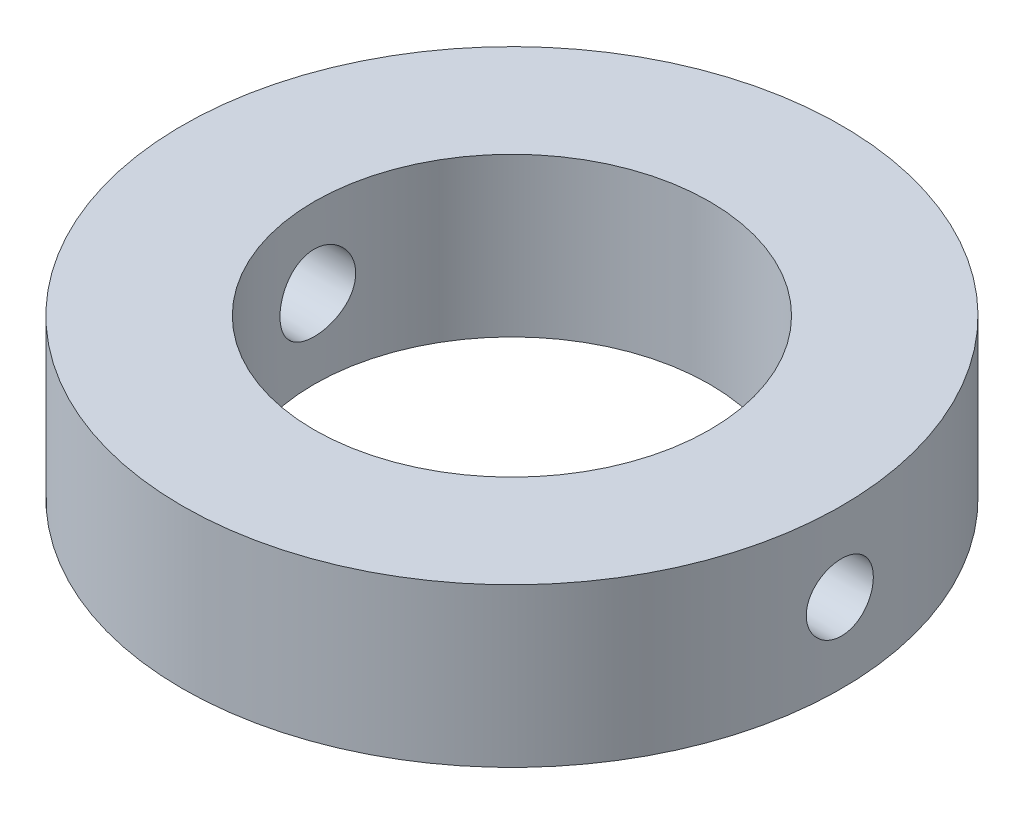
ISO-10303-21;
HEADER;
FILE_DESCRIPTION(('STEP AP214'),'2;1');
FILE_NAME('part.step','',(''),(''),'','','');
FILE_SCHEMA(('AUTOMOTIVE_DESIGN { 1 0 10303 214 1 1 1 1 }'));
ENDSEC;
DATA;
#1=APPLICATION_CONTEXT('core data for automotive mechanical design processes');
#2=APPLICATION_PROTOCOL_DEFINITION('international standard','automotive_design',2000,#1);
#3=PRODUCT_CONTEXT('',#1,'mechanical');
#4=PRODUCT('Part','Part','',(#3));
#5=PRODUCT_RELATED_PRODUCT_CATEGORY('part','',(#4));
#6=PRODUCT_DEFINITION_FORMATION('','',#4);
#7=PRODUCT_DEFINITION_CONTEXT('part definition',#1,'design');
#8=PRODUCT_DEFINITION('design','',#6,#7);
#9=PRODUCT_DEFINITION_SHAPE('','',#8);
#10=(LENGTH_UNIT() NAMED_UNIT(*) SI_UNIT(.MILLI.,.METRE.));
#11=(NAMED_UNIT(*) PLANE_ANGLE_UNIT() SI_UNIT($,.RADIAN.));
#12=(NAMED_UNIT(*) SI_UNIT($,.STERADIAN.) SOLID_ANGLE_UNIT());
#13=UNCERTAINTY_MEASURE_WITH_UNIT(LENGTH_MEASURE(1.E-05),#10,'distance_accuracy_value','');
#14=(GEOMETRIC_REPRESENTATION_CONTEXT(3) GLOBAL_UNCERTAINTY_ASSIGNED_CONTEXT((#13)) GLOBAL_UNIT_ASSIGNED_CONTEXT((#10,
#11,#12)) REPRESENTATION_CONTEXT('',''));
#15=CARTESIAN_POINT('',(0.,0.,0.));
#16=DIRECTION('',(0.,0.,1.));
#17=DIRECTION('',(1.,0.,0.));
#18=AXIS2_PLACEMENT_3D('',#15,#16,#17);
#19=CARTESIAN_POINT('',(0.05369384699367,7.98000184373753,7.33379435484455E-06));
#20=DIRECTION('',(0.,-1.,0.));
#21=DIRECTION('',(0.,0.,-1.));
#22=AXIS2_PLACEMENT_3D('',#19,#20,#21);
#23=CYLINDRICAL_SURFACE('',#22,8.25);
#24=CARTESIAN_POINT('',(0.05369384699367,7.98000184373753,7.33379435484455E-06));
#25=DIRECTION('',(0.,1.,0.));
#26=DIRECTION('',(0.,0.,1.));
#27=AXIS2_PLACEMENT_3D('',#24,#25,#26);
#28=CIRCLE('',#27,8.25);
#29=CARTESIAN_POINT('',(0.05369384699367,7.98000184373753,8.25000733379436));
#30=VERTEX_POINT('',#29);
#31=EDGE_CURVE('E10',#30,#30,#28,.T.);
#32=ORIENTED_EDGE('',*,*,#31,.F.);
#33=EDGE_LOOP('',(#32));
#34=FACE_BOUND('',#33,.T.);
#35=CARTESIAN_POINT('',(0.05369384699367,4.02000184373753,7.33379435484455E-06));
#36=DIRECTION('',(0.,1.,0.));
#37=DIRECTION('',(0.,0.,1.));
#38=AXIS2_PLACEMENT_3D('',#35,#36,#37);
#39=CIRCLE('',#38,8.25);
#40=CARTESIAN_POINT('',(0.05369384699367,4.02000184373753,8.25000733379436));
#41=VERTEX_POINT('',#40);
#42=EDGE_CURVE('E50',#41,#41,#39,.T.);
#43=ORIENTED_EDGE('',*,*,#42,.T.);
#44=EDGE_LOOP('',(#43));
#45=FACE_BOUND('',#44,.T.);
#46=CARTESIAN_POINT('',(8.281543153376,5.4179232808724,-0.604141481866051));
#47=CARTESIAN_POINT('',(8.27914441839346,5.4518043739237,-0.636809933368332));
#48=CARTESIAN_POINT('',(8.27675797303766,5.48846330693886,-0.666642796564216));
#49=CARTESIAN_POINT('',(8.27227895612903,5.56630631701054,-0.719766153946628));
#50=CARTESIAN_POINT('',(8.27018670383326,5.60749522493009,-0.743049567687996));
#51=CARTESIAN_POINT('',(8.26653554921752,5.69321143001678,-0.782375355667081));
#52=CARTESIAN_POINT('',(8.26497652147406,5.73773793911505,-0.798419433003812));
#53=CARTESIAN_POINT('',(8.26256956120308,5.82886011761066,-0.822799531657169));
#54=CARTESIAN_POINT('',(8.26172145062824,5.87545526584275,-0.83113748300649));
#55=CARTESIAN_POINT('',(8.260834442908,5.96922438513462,-0.839851433456671));
#56=CARTESIAN_POINT('',(8.26079267472097,6.0163957039339,-0.840255681180892));
#57=CARTESIAN_POINT('',(8.26151578371179,6.1101351489498,-0.833162142463666));
#58=CARTESIAN_POINT('',(8.26228068084862,6.15670326021267,-0.825664160500793));
#59=CARTESIAN_POINT('',(8.26452771770222,6.24781969679537,-0.803008905205402));
#60=CARTESIAN_POINT('',(8.26600843010086,6.29237184937326,-0.787866871277587));
#61=CARTESIAN_POINT('',(8.2695193649486,6.37830528278482,-0.75036838302934));
#62=CARTESIAN_POINT('',(8.27154960028617,6.41968648921822,-0.728011759496252));
#63=CARTESIAN_POINT('',(8.27594077195377,6.49828083709476,-0.676617271438643));
#64=CARTESIAN_POINT('',(8.27830297169017,6.53547702873221,-0.647553596037037));
#65=CARTESIAN_POINT('',(8.28308715067142,6.60447767694655,-0.583611694166962));
#66=CARTESIAN_POINT('',(8.28550913135941,6.63628200321425,-0.548733327210947));
#67=CARTESIAN_POINT('',(8.2901513216174,6.69372208164756,-0.473989672669532));
#68=CARTESIAN_POINT('',(8.29237070630131,6.71933325946909,-0.434105442228705));
#69=CARTESIAN_POINT('',(8.29634712300738,6.76349586655491,-0.3505817261051));
#70=CARTESIAN_POINT('',(8.29810416050213,6.78204737938205,-0.306942284878963));
#71=CARTESIAN_POINT('',(8.30095521184912,6.81152897448688,-0.217223612474388));
#72=CARTESIAN_POINT('',(8.30205037223232,6.8224722410588,-0.171148751510458));
#73=CARTESIAN_POINT('',(8.30345887904823,6.83646896406458,-0.0778046128225622));
#74=CARTESIAN_POINT('',(8.30377224817821,6.83952264955201,-0.0305353698146244));
#75=CARTESIAN_POINT('',(8.30358225763077,6.83765484257123,0.0636445275321381));
#76=CARTESIAN_POINT('',(8.30308231533681,6.83276672021477,0.110555854457408));
#77=CARTESIAN_POINT('',(8.30132821873207,6.81522121266067,0.202887296133946));
#78=CARTESIAN_POINT('',(8.30007406299377,6.8025638127579,0.248307408062581));
#79=CARTESIAN_POINT('',(8.29695149641156,6.76984341630692,0.336380730736448));
#80=CARTESIAN_POINT('',(8.29508299589419,6.74977933858298,0.379033536460137));
#81=CARTESIAN_POINT('',(8.2909400038241,6.702816907517,0.460372852304088));
#82=CARTESIAN_POINT('',(8.28866550037064,6.6759183538334,0.499059246108764));
#83=CARTESIAN_POINT('',(8.28395350920555,6.61591375830947,0.571543002704544));
#84=CARTESIAN_POINT('',(8.28151536980545,6.58278181681244,0.605318885122982));
#85=CARTESIAN_POINT('',(8.27675860110145,6.51131457687402,0.666835989191299));
#86=CARTESIAN_POINT('',(8.2744399731219,6.47297922078867,0.69457714397898));
#87=CARTESIAN_POINT('',(8.27018064193647,6.39211838308672,0.743274060544141));
#88=CARTESIAN_POINT('',(8.26824050711849,6.34958674188914,0.764219648134994));
#89=CARTESIAN_POINT('',(8.26496364847715,6.26158558645108,0.798662119591424));
#90=CARTESIAN_POINT('',(8.26362690727173,6.21611615688314,0.812159218029431));
#91=CARTESIAN_POINT('',(8.26171408972452,6.12372765523641,0.831269375859325));
#92=CARTESIAN_POINT('',(8.26113493220413,6.07681525440201,0.836914376601099));
#93=CARTESIAN_POINT('',(8.2607934579889,5.9827058254178,0.840256734760433));
#94=CARTESIAN_POINT('',(8.26103112121582,5.9355088042927,0.83795428753396));
#95=CARTESIAN_POINT('',(8.26229363737728,5.84235363994318,0.825493666328342));
#96=CARTESIAN_POINT('',(8.26331557068489,5.79639155474618,0.815364627692853));
#97=CARTESIAN_POINT('',(8.26602728831908,5.70682232293578,0.787581280275774));
#98=CARTESIAN_POINT('',(8.26771708214369,5.66321520982378,0.769926864471286));
#99=CARTESIAN_POINT('',(8.27157872533978,5.5794810255187,0.727550905212589));
#100=CARTESIAN_POINT('',(8.27375166148677,5.53936208815808,0.702813392428938));
#101=CARTESIAN_POINT('',(8.27833356368045,5.46383192966015,0.646987595186825));
#102=CARTESIAN_POINT('',(8.280742537573,5.42842086510422,0.615899099585172));
#103=CARTESIAN_POINT('',(8.28553922015379,5.36313362145758,0.548076993355185));
#104=CARTESIAN_POINT('',(8.28792677085323,5.33328488032926,0.511316952730326));
#105=CARTESIAN_POINT('',(8.29240048506751,5.2801761010273,0.433294025304907));
#106=CARTESIAN_POINT('',(8.29448664781506,5.25691607962768,0.392031127041032));
#107=CARTESIAN_POINT('',(8.29812348305305,5.21764399509632,0.306153437937454));
#108=CARTESIAN_POINT('',(8.2996740174055,5.20163380135693,0.261537786032875));
#109=CARTESIAN_POINT('',(8.30206378091719,5.17733639548718,0.170234494301596));
#110=CARTESIAN_POINT('',(8.30290305574807,5.16904868747444,0.123546987716187));
#111=CARTESIAN_POINT('',(8.30377367396642,5.16045662858152,0.0296386901584073));
#112=CARTESIAN_POINT('',(8.30380847442263,5.16011811750802,-0.0175789462114635));
#113=CARTESIAN_POINT('',(8.30307491531791,5.16734900429098,-0.111409432492594));
#114=CARTESIAN_POINT('',(8.30230638621326,5.17492007147377,-0.158022152633081));
#115=CARTESIAN_POINT('',(8.30005398847603,5.19773284018011,-0.249242274313732));
#116=CARTESIAN_POINT('',(8.29857106401594,5.21296441844173,-0.293852237944114));
#117=CARTESIAN_POINT('',(8.29505660565977,5.25064755193672,-0.379847773602653));
#118=CARTESIAN_POINT('',(8.29302565066879,5.27309149323061,-0.42123668904029));
#119=CARTESIAN_POINT('',(8.28937757122083,5.31591362015142,-0.486510693378438));
#120=CARTESIAN_POINT('',(8.28784949484164,5.33446838657481,-0.511617312153325));
#121=CARTESIAN_POINT('',(8.284726865656,5.37425011799443,-0.55961130608443));
#122=CARTESIAN_POINT('',(8.28313231252842,5.39547709590044,-0.582498670518217));
#123=CARTESIAN_POINT('',(8.281543153376,5.4179232808724,-0.604141481866051));
#124=B_SPLINE_CURVE_WITH_KNOTS('',3,(#46,#47,#48,#49,#50,#51,#52,#53,#54,#55,#56,#57,#58,#59,
#60,#61,#62,#63,#64,#65,#66,#67,#68,#69,#70,#71,#72,#73,#74,#75,#76,#77,#78,#79,#80,#81,#82,#83,
#84,#85,#86,#87,#88,#89,#90,#91,#92,#93,#94,#95,#96,#97,#98,#99,#100,#101,#102,#103,#104,#105,
#106,#107,#108,#109,#110,#111,#112,#113,#114,#115,#116,#117,#118,#119,#120,#121,#122,#123),
.UNSPECIFIED.,.T.,.F.,(4,2,2,2,2,2,2,2,2,2,2,2,2,2,2,2,2,2,2,2,2,2,2,2,2,2,2,2,2,2,2,2,2,2,2,2,
2,2,4),(0.,0.141266561509224,0.282685260898516,0.42407067328882,0.565420665485513,
0.706267277401448,0.847117374305536,0.98768777078774,1.12826146448027,1.26938542820794,
1.41051280209645,1.55219130207197,1.69386812499537,1.83529882073609,1.97672541035625,
2.11755928510037,2.25839342640526,2.39924813384084,2.54010697067973,2.68156454444276,
2.82302368541535,2.96469364917587,3.10635953156432,3.24744743266647,3.38853186571607,
3.52909361193858,3.66965735724064,3.81054054278327,3.95142841285563,4.09299385501519,
4.2345596575786,4.37616194260137,4.51775513431915,4.65873974379646,4.79975411426324,
4.94058262386613,5.081262949508,5.17485143101583,5.26844036467826),.UNSPECIFIED.);
#125=CARTESIAN_POINT('',(8.281543153376,5.4179232808724,-0.604141481866051));
#126=VERTEX_POINT('',#125);
#127=EDGE_CURVE('E80',#126,#126,#124,.T.);
#128=ORIENTED_EDGE('',*,*,#127,.F.);
#129=EDGE_LOOP('',(#128));
#130=FACE_BOUND('',#129,.T.);
#131=CARTESIAN_POINT('',(-8.1665029028169,5.32050658542989,-0.700610532380716));
#132=CARTESIAN_POINT('',(-8.169750768116,5.28117652553001,-0.662500873762695));
#133=CARTESIAN_POINT('',(-8.17301580716168,5.24503662954337,-0.621050521829441));
#134=CARTESIAN_POINT('',(-8.17921354627576,5.1801859346757,-0.532627428870309));
#135=CARTESIAN_POINT('',(-8.1821458960634,5.1514829258558,-0.485648971492122));
#136=CARTESIAN_POINT('',(-8.18734606111301,5.10236299364315,-0.3875127247289));
#137=CARTESIAN_POINT('',(-8.18961398933311,5.08194466154715,-0.3363556476433));
#138=CARTESIAN_POINT('',(-8.1932295897774,5.04999430408332,-0.231320235207912));
#139=CARTESIAN_POINT('',(-8.19457749480215,5.03846003061864,-0.177442591972542));
#140=CARTESIAN_POINT('',(-8.1961977554654,5.02464484710596,-0.0687530906533021));
#141=CARTESIAN_POINT('',(-8.19647509602801,5.02232104849267,-0.0139467588804861));
#142=CARTESIAN_POINT('',(-8.19593683667822,5.02687833036017,0.0952773473122893));
#143=CARTESIAN_POINT('',(-8.19512122024281,5.03375954999981,0.149695115845557));
#144=CARTESIAN_POINT('',(-8.19249314764508,5.05648325090549,0.256406979905305));
#145=CARTESIAN_POINT('',(-8.19068406415385,5.07229541809973,0.308707621305202));
#146=CARTESIAN_POINT('',(-8.18627244392618,5.1123982206883,0.409914190982378));
#147=CARTESIAN_POINT('',(-8.1836698855177,5.13668908766247,0.458820026493134));
#148=CARTESIAN_POINT('',(-8.17794598090329,5.19318708883011,0.552096120055921));
#149=CARTESIAN_POINT('',(-8.17482231471301,5.22542994711939,0.596444594110067));
#150=CARTESIAN_POINT('',(-8.16841201766017,5.29686787308332,0.67912287426919));
#151=CARTESIAN_POINT('',(-8.16512538081995,5.33606319590623,0.717452459389792));
#152=CARTESIAN_POINT('',(-8.15873699639936,5.42055870811808,0.787228674866759));
#153=CARTESIAN_POINT('',(-8.1556364071936,5.46589236383708,0.818634902018703));
#154=CARTESIAN_POINT('',(-8.14999180834422,5.56122005976149,0.873392991532286));
#155=CARTESIAN_POINT('',(-8.14744779252478,5.61121404824621,0.896744943267309));
#156=CARTESIAN_POINT('',(-8.14321025481396,5.71436888063927,0.934688807589225));
#157=CARTESIAN_POINT('',(-8.14151540709326,5.76752464188109,0.949294383137205));
#158=CARTESIAN_POINT('',(-8.1391651065917,5.87555573924513,0.969370963022904));
#159=CARTESIAN_POINT('',(-8.13850961043764,5.93043100351329,0.974842348540124));
#160=CARTESIAN_POINT('',(-8.13831416399643,6.03999610412597,0.976483303833195));
#161=CARTESIAN_POINT('',(-8.13876763034108,6.09468511405518,0.972707767862687));
#162=CARTESIAN_POINT('',(-8.1407244097187,6.20264571520595,0.956081792603448));
#163=CARTESIAN_POINT('',(-8.14222772009817,6.25591731000971,0.94323137625162));
#164=CARTESIAN_POINT('',(-8.14611194100356,6.35950436527041,0.908842820806134));
#165=CARTESIAN_POINT('',(-8.14849228574602,6.40982170733659,0.887310281791853));
#166=CARTESIAN_POINT('',(-8.15386267900251,6.50613711793617,0.836173525923888));
#167=CARTESIAN_POINT('',(-8.15685275098524,6.55213502011262,0.806568998360557));
#168=CARTESIAN_POINT('',(-8.16312668713303,6.63878596604137,0.73992848654822));
#169=CARTESIAN_POINT('',(-8.16641212087595,6.67940722783769,0.70285132032146));
#170=CARTESIAN_POINT('',(-8.17289378492025,6.75386270562605,0.622406583936499));
#171=CARTESIAN_POINT('',(-8.17609001341115,6.78769678395405,0.579038886218573));
#172=CARTESIAN_POINT('',(-8.18204394447004,6.84770827415085,0.487088688033914));
#173=CARTESIAN_POINT('',(-8.1848003746153,6.87386364706164,0.438491713936673));
#174=CARTESIAN_POINT('',(-8.18955249245209,6.91762936540765,0.337556509000947));
#175=CARTESIAN_POINT('',(-8.1915482061072,6.93524000248394,0.285218405921203));
#176=CARTESIAN_POINT('',(-8.19454543107405,6.96133177905384,0.178556610446158));
#177=CARTESIAN_POINT('',(-8.19555173665225,6.96985695999805,0.124243828741367));
#178=CARTESIAN_POINT('',(-8.1964735678104,6.97767501773691,0.0149495249618479));
#179=CARTESIAN_POINT('',(-8.19638913312665,6.97696823085746,-0.0400319726782691));
#180=CARTESIAN_POINT('',(-8.1951425942363,6.96637360762032,-0.148786629299616));
#181=CARTESIAN_POINT('',(-8.19398635679544,6.95653575195259,-0.202564735529569));
#182=CARTESIAN_POINT('',(-8.19073358491757,6.92804048408607,-0.307700650226815));
#183=CARTESIAN_POINT('',(-8.18863703823465,6.90938295702603,-0.359058427163847));
#184=CARTESIAN_POINT('',(-8.18373108121783,6.86373921514766,-0.458024422173419));
#185=CARTESIAN_POINT('',(-8.18092015393371,6.83673525038905,-0.505624375220959));
#186=CARTESIAN_POINT('',(-8.17489943763293,6.77517822781071,-0.595635616096379));
#187=CARTESIAN_POINT('',(-8.17168963079285,6.74062483260203,-0.638046671896882));
#188=CARTESIAN_POINT('',(-8.1652055237742,6.66468371662813,-0.716767692736732));
#189=CARTESIAN_POINT('',(-8.1619309395656,6.62325290955428,-0.75303608056416));
#190=CARTESIAN_POINT('',(-8.15570607094207,6.53487571086325,-0.818115525349237));
#191=CARTESIAN_POINT('',(-8.15275578958541,6.48792926724034,-0.846926511984492));
#192=CARTESIAN_POINT('',(-8.14751036219178,6.38977394891659,-0.896301570595529));
#193=CARTESIAN_POINT('',(-8.14521603637273,6.33855984024807,-0.916855330486471));
#194=CARTESIAN_POINT('',(-8.14155053693781,6.23337632998171,-0.949062976787618));
#195=CARTESIAN_POINT('',(-8.14017929596132,6.1794071297415,-0.960717512612669));
#196=CARTESIAN_POINT('',(-8.13852269564602,6.07056776546731,-0.974743163965421));
#197=CARTESIAN_POINT('',(-8.13823128902826,6.01570435244876,-0.977165981050031));
#198=CARTESIAN_POINT('',(-8.13875111300246,5.90633889357504,-0.972797955907845));
#199=CARTESIAN_POINT('',(-8.13956255620085,5.85183691943333,-0.966005337137833));
#200=CARTESIAN_POINT('',(-8.14219131980661,5.74491623477982,-0.943440287753277));
#201=CARTESIAN_POINT('',(-8.14400581601782,5.69249211600009,-0.92769306616688));
#202=CARTESIAN_POINT('',(-8.1484323880307,5.59107135644039,-0.887701460111099));
#203=CARTESIAN_POINT('',(-8.15104366134778,5.54207132779107,-0.863465621449299));
#204=CARTESIAN_POINT('',(-8.15584514817002,5.46387045935473,-0.816285319662123));
#205=CARTESIAN_POINT('',(-8.15790020941485,5.43337467155648,-0.79543774623307));
#206=CARTESIAN_POINT('',(-8.162135216765,5.37493895147735,-0.750435561897352));
#207=CARTESIAN_POINT('',(-8.16431516369087,5.34699903599308,-0.726280929260047));
#208=CARTESIAN_POINT('',(-8.1665029028169,5.32050658542989,-0.700610532380716));
#209=B_SPLINE_CURVE_WITH_KNOTS('',3,(#131,#132,#133,#134,#135,#136,#137,#138,#139,#140,#141,
#142,#143,#144,#145,#146,#147,#148,#149,#150,#151,#152,#153,#154,#155,#156,#157,#158,#159,#160,
#161,#162,#163,#164,#165,#166,#167,#168,#169,#170,#171,#172,#173,#174,#175,#176,#177,#178,#179,
#180,#181,#182,#183,#184,#185,#186,#187,#188,#189,#190,#191,#192,#193,#194,#195,#196,#197,#198,
#199,#200,#201,#202,#203,#204,#205,#206,#207,#208),.UNSPECIFIED.,.T.,.F.,(4,2,2,2,2,2,2,2,2,2,2,
2,2,2,2,2,2,2,2,2,2,2,2,2,2,2,2,2,2,2,2,2,2,2,2,2,2,2,4),(0.,0.164449982077037,
0.329071533653673,0.493665081700143,0.658216965916189,0.822001707920912,0.985788926004779,
1.14902351801219,1.31226256881627,1.4762487691775,1.64024098890874,1.80516628469675,
1.9700897503504,2.13475490775177,2.29941319332853,2.46309635858449,2.62677911013016,
2.79035645268419,2.95394009260039,3.11845119115448,3.28296562613966,3.44794772507204,
3.61292419259084,3.7770972529442,3.94126433239522,4.10453807736442,4.26781394875569,
4.43143946788944,4.59507230105029,4.75977190197987,4.92447305595023,5.08937926322036,
5.2542734354214,5.41824276099054,5.58224370090693,5.74578521448538,5.9091625557282,
6.01993417424324,6.13070652067197),.UNSPECIFIED.);
#210=CARTESIAN_POINT('',(-8.1665029028169,5.32050658542989,-0.700610532380716));
#211=VERTEX_POINT('',#210);
#212=EDGE_CURVE('E86',#211,#211,#209,.T.);
#213=ORIENTED_EDGE('',*,*,#212,.F.);
#214=EDGE_LOOP('',(#213));
#215=FACE_BOUND('',#214,.T.);
#216=ADVANCED_FACE('F36',(#34,#45,#130,#215),#23,.T.);
#217=CARTESIAN_POINT('',(0.05369384699367,7.98000184373753,7.33379435484455E-06));
#218=DIRECTION('',(0.,-1.,0.));
#219=DIRECTION('',(0.,0.,-1.));
#220=AXIS2_PLACEMENT_3D('',#217,#218,#219);
#221=CYLINDRICAL_SURFACE('',#220,4.95);
#222=CARTESIAN_POINT('',(4.96292025344206,5.40925506509417,-0.634024282317814));
#223=CARTESIAN_POINT('',(4.9586478620166,5.4447103297846,-0.667105469862291));
#224=CARTESIAN_POINT('',(4.95441764880179,5.48296889450953,-0.697224229771995));
#225=CARTESIAN_POINT('',(4.94651623682512,5.56405111681171,-0.750674431506424));
#226=CARTESIAN_POINT('',(4.94284550086255,5.60687850447396,-0.774000268597175));
#227=CARTESIAN_POINT('',(4.93648396239051,5.69591573754345,-0.813169381728261));
#228=CARTESIAN_POINT('',(4.93379339804825,5.74212640176533,-0.829010839452345));
#229=CARTESIAN_POINT('',(4.92970852298512,5.83659685720979,-0.852710260010788));
#230=CARTESIAN_POINT('',(4.92831387986662,5.88485611965398,-0.860570270096545));
#231=CARTESIAN_POINT('',(4.92699198508076,5.9815131589325,-0.868024714477281));
#232=CARTESIAN_POINT('',(4.92704933497804,6.02990404446687,-0.867705885163916));
#233=CARTESIAN_POINT('',(4.92858667518093,6.12593579125726,-0.859026323305532));
#234=CARTESIAN_POINT('',(4.93006667320765,6.17357664844122,-0.850665547114513));
#235=CARTESIAN_POINT('',(4.93426680670662,6.26651733044645,-0.826224359824244));
#236=CARTESIAN_POINT('',(4.9369806802156,6.31182770545958,-0.810182906868136));
#237=CARTESIAN_POINT('',(4.94334012818273,6.39912470336329,-0.770871160053866));
#238=CARTESIAN_POINT('',(4.94698577028861,6.44111108463716,-0.747600341306969));
#239=CARTESIAN_POINT('',(4.95485280748769,6.52111562851717,-0.69416580998627));
#240=CARTESIAN_POINT('',(4.95908056843297,6.55908031194377,-0.663922969914559));
#241=CARTESIAN_POINT('',(4.96760845729992,6.62943737177234,-0.597538227136646));
#242=CARTESIAN_POINT('',(4.97190859032236,6.66182935359007,-0.561395907060923));
#243=CARTESIAN_POINT('',(4.98015238839639,6.72047178827437,-0.483772677933398));
#244=CARTESIAN_POINT('',(4.98409172883683,6.74665254272429,-0.44223859999242));
#245=CARTESIAN_POINT('',(4.99111828100804,6.79166278710608,-0.355294689319334));
#246=CARTESIAN_POINT('',(4.99420553060152,6.81049260369269,-0.30988502891638));
#247=CARTESIAN_POINT('',(4.99916330714415,6.84014254577197,-0.216766163313163));
#248=CARTESIAN_POINT('',(5.0010412172319,6.85101133125859,-0.169072859200798));
#249=CARTESIAN_POINT('',(5.00339818378944,6.8645895915856,-0.0725061582077349));
#250=CARTESIAN_POINT('',(5.0038773601162,6.86729976553507,-0.0236328628019444));
#251=CARTESIAN_POINT('',(5.0033860502647,6.86449462874442,0.0732574884945987));
#252=CARTESIAN_POINT('',(5.00243354586282,6.85908134918995,0.121277627138124));
#253=CARTESIAN_POINT('',(4.99921748661834,6.84038369697462,0.215713283991001));
#254=CARTESIAN_POINT('',(4.99695392232392,6.82709926756828,0.262128790629527));
#255=CARTESIAN_POINT('',(4.99136190489888,6.79304260748808,0.352100196803631));
#256=CARTESIAN_POINT('',(4.98803253690252,6.77226394195551,0.395653600710516));
#257=CARTESIAN_POINT('',(4.9806720226331,6.72381583023479,0.478677759067827));
#258=CARTESIAN_POINT('',(4.97664081691189,6.69614580023798,0.518148167222124));
#259=CARTESIAN_POINT('',(4.96825962603072,6.63427812771162,0.592426359630926));
#260=CARTESIAN_POINT('',(4.96390621250143,6.60000123656766,0.627167772477296));
#261=CARTESIAN_POINT('',(4.95541204164175,6.52609352610081,0.690427512789307));
#262=CARTESIAN_POINT('',(4.95127129241021,6.48646250308563,0.718945603387215));
#263=CARTESIAN_POINT('',(4.94365141344688,6.40272405417696,0.769073913367883));
#264=CARTESIAN_POINT('',(4.94017557854333,6.3585959165966,0.79065007574677));
#265=CARTESIAN_POINT('',(4.93431530160569,6.2672667945343,0.826057312984899));
#266=CARTESIAN_POINT('',(4.93193076332427,6.22006608145891,0.839889070888958));
#267=CARTESIAN_POINT('',(4.92855588785486,6.12452305046987,0.859260882557715));
#268=CARTESIAN_POINT('',(4.92754947880529,6.07620069539052,0.864896568588383));
#269=CARTESIAN_POINT('',(4.92699715517966,5.9792876983706,0.868003728599449));
#270=CARTESIAN_POINT('',(4.9274511376625,5.9306970755809,0.865475778023856));
#271=CARTESIAN_POINT('',(4.9297530529165,5.83517776966686,0.852409174351723));
#272=CARTESIAN_POINT('',(4.93158589014375,5.78823681047424,0.841957262344157));
#273=CARTESIAN_POINT('',(4.93641792523277,5.69678204787004,0.81346458610507));
#274=CARTESIAN_POINT('',(4.93941717481032,5.65226835217702,0.795423485385142));
#275=CARTESIAN_POINT('',(4.94626899789836,5.5665870356067,0.752130794786583));
#276=CARTESIAN_POINT('',(4.95012726018187,5.52544434728277,0.726830794730218));
#277=CARTESIAN_POINT('',(4.95825603096864,5.44794822707553,0.66978163360464));
#278=CARTESIAN_POINT('',(4.96252657710361,5.41159523309494,0.638031883533997));
#279=CARTESIAN_POINT('',(4.97107172673618,5.34418077064298,0.56845914557473));
#280=CARTESIAN_POINT('',(4.97534555461211,5.31320025703199,0.530557562206291));
#281=CARTESIAN_POINT('',(4.98335890053374,5.25802630607579,0.450047780432319));
#282=CARTESIAN_POINT('',(4.98709841739525,5.23383288377268,0.40743957159586));
#283=CARTESIAN_POINT('',(4.99362513657609,5.19292980772792,0.318687342825755));
#284=CARTESIAN_POINT('',(4.99641211477041,5.17622191498656,0.272542493870505));
#285=CARTESIAN_POINT('',(5.00071695187327,5.15080930038041,0.17804467939411));
#286=CARTESIAN_POINT('',(5.0022349595483,5.14210364036981,0.129691973410039));
#287=CARTESIAN_POINT('',(5.00381916015439,5.13302562746672,0.0328138648671901));
#288=CARTESIAN_POINT('',(5.0039037074559,5.13254792062604,-0.0157013852402304));
#289=CARTESIAN_POINT('',(5.00265854416584,5.13967192414319,-0.112123993832412));
#290=CARTESIAN_POINT('',(5.00132863929362,5.14727474439349,-0.160031267894525));
#291=CARTESIAN_POINT('',(4.997412688844,5.17026567422375,-0.253624604339609));
#292=CARTESIAN_POINT('',(4.99483295321741,5.18561469205964,-0.299320569608693));
#293=CARTESIAN_POINT('',(4.98870307638716,5.22361844179294,-0.387464628558226));
#294=CARTESIAN_POINT('',(4.98515367353976,5.24626761731161,-0.429915162132627));
#295=CARTESIAN_POINT('',(4.97845005088967,5.29159404587926,-0.500182239723972));
#296=CARTESIAN_POINT('',(4.97542504658704,5.31279802938117,-0.52897412657985));
#297=CARTESIAN_POINT('',(4.96923249778121,5.35858006574994,-0.583720463324271));
#298=CARTESIAN_POINT('',(4.96606495015361,5.38315819259913,-0.609674850974662));
#299=CARTESIAN_POINT('',(4.96292025344206,5.40925506509417,-0.634024282317814));
#300=B_SPLINE_CURVE_WITH_KNOTS('',3,(#222,#223,#224,#225,#226,#227,#228,#229,#230,#231,#232,
#233,#234,#235,#236,#237,#238,#239,#240,#241,#242,#243,#244,#245,#246,#247,#248,#249,#250,#251,
#252,#253,#254,#255,#256,#257,#258,#259,#260,#261,#262,#263,#264,#265,#266,#267,#268,#269,#270,
#271,#272,#273,#274,#275,#276,#277,#278,#279,#280,#281,#282,#283,#284,#285,#286,#287,#288,#289,
#290,#291,#292,#293,#294,#295,#296,#297,#298,#299),.UNSPECIFIED.,.T.,.F.,(4,2,2,2,2,2,2,2,2,2,2,
2,2,2,2,2,2,2,2,2,2,2,2,2,2,2,2,2,2,2,2,2,2,2,2,2,2,2,4),(0.,0.145910810656142,0.29194167114124,
0.438007991335797,0.584036835863649,0.728517694601479,0.872999337483646,1.01675577729591,
1.16052265699735,1.30600937845608,1.45150639710406,1.59856609753386,1.74561926230516,
1.89176592150623,2.03790005708551,2.1822140347729,2.32652905287573,2.47096828193493,
2.61541975146878,2.76172587619746,2.90803756855651,3.05505649001214,3.20206244257678,
3.34733896435837,3.49260524601249,3.63630390106003,3.78000892807049,3.92469554572764,
4.06939538234142,4.21611524323609,4.362835429301,4.50959011376606,4.65632759117643,
4.80118476717071,4.94606184244455,5.09021498888929,5.23425867393383,5.34165407351529,
5.44905182825184),.UNSPECIFIED.);
#301=CARTESIAN_POINT('',(4.96292025344206,5.40925506509417,-0.634024282317814));
#302=VERTEX_POINT('',#301);
#303=EDGE_CURVE('E61',#302,#302,#300,.T.);
#304=ORIENTED_EDGE('',*,*,#303,.T.);
#305=EDGE_LOOP('',(#304));
#306=FACE_BOUND('',#305,.T.);
#307=CARTESIAN_POINT('',(0.05369384699367,7.98000184373753,7.33379435484455E-06));
#308=DIRECTION('',(0.,1.,0.));
#309=DIRECTION('',(0.,0.,1.));
#310=AXIS2_PLACEMENT_3D('',#307,#308,#309);
#311=CIRCLE('',#310,4.95);
#312=CARTESIAN_POINT('',(0.05369384699367,7.98000184373753,4.95000733379436));
#313=VERTEX_POINT('',#312);
#314=EDGE_CURVE('E56',#313,#313,#311,.T.);
#315=ORIENTED_EDGE('',*,*,#314,.T.);
#316=EDGE_LOOP('',(#315));
#317=FACE_BOUND('',#316,.T.);
#318=CARTESIAN_POINT('',(0.05369384699367,4.02000184373753,7.33379435484455E-06));
#319=DIRECTION('',(0.,1.,0.));
#320=DIRECTION('',(0.,0.,1.));
#321=AXIS2_PLACEMENT_3D('',#318,#319,#320);
#322=CIRCLE('',#321,4.95);
#323=CARTESIAN_POINT('',(0.05369384699367,4.02000184373753,4.95000733379436));
#324=VERTEX_POINT('',#323);
#325=EDGE_CURVE('E59',#324,#324,#322,.T.);
#326=ORIENTED_EDGE('',*,*,#325,.F.);
#327=EDGE_LOOP('',(#326));
#328=FACE_BOUND('',#327,.T.);
#329=CARTESIAN_POINT('',(-4.84782966595988,5.3505459643451,-0.691055074359596));
#330=CARTESIAN_POINT('',(-4.85295902506311,5.31177116633092,-0.654671098534876));
#331=CARTESIAN_POINT('',(-4.85813706307755,5.27604637972052,-0.615005661967569));
#332=CARTESIAN_POINT('',(-4.86801486860254,5.2117052390738,-0.530186391071338));
#333=CARTESIAN_POINT('',(-4.87271425071758,5.18309458677083,-0.485028197373373));
#334=CARTESIAN_POINT('',(-4.88111013378706,5.1338216565506,-0.390454902780379));
#335=CARTESIAN_POINT('',(-4.88480634252066,5.11316169391009,-0.341038567014711));
#336=CARTESIAN_POINT('',(-4.89077691237033,5.08044156690555,-0.239364912333166));
#337=CARTESIAN_POINT('',(-4.8930516500744,5.0683791246953,-0.187108349865097));
#338=CARTESIAN_POINT('',(-4.89590500706179,5.05332156475143,-0.0818916466038594));
#339=CARTESIAN_POINT('',(-4.89650339678485,5.05022074193138,-0.0289471704047764));
#340=CARTESIAN_POINT('',(-4.8959937661136,5.05288474369124,0.0767093030424968));
#341=CARTESIAN_POINT('',(-4.89488578854108,5.05864934579076,0.129421306091376));
#342=CARTESIAN_POINT('',(-4.89110555357704,5.07876322865503,0.232603647122624));
#343=CARTESIAN_POINT('',(-4.88844806856761,5.09303146723011,0.283090375632591));
#344=CARTESIAN_POINT('',(-4.88186977152025,5.12965181038395,0.380952441047776));
#345=CARTESIAN_POINT('',(-4.8779488807169,5.15200441898305,0.428327583743424));
#346=CARTESIAN_POINT('',(-4.86921810377699,5.20443085745911,0.519185040605615));
#347=CARTESIAN_POINT('',(-4.86439914004469,5.23458487344209,0.562620190666441));
#348=CARTESIAN_POINT('',(-4.85442421942127,5.30165765922523,0.643867159773775));
#349=CARTESIAN_POINT('',(-4.84926822823968,5.33857711805892,0.681678405336651));
#350=CARTESIAN_POINT('',(-4.83910447235034,5.41879533310359,0.751193078948294));
#351=CARTESIAN_POINT('',(-4.83410012037917,5.46218197963263,0.782795683866608));
#352=CARTESIAN_POINT('',(-4.8248919670607,5.55372019716166,0.838276036130708));
#353=CARTESIAN_POINT('',(-4.82068814802468,5.60187166284159,0.862153954170739));
#354=CARTESIAN_POINT('',(-4.81358052220853,5.7014476398337,0.90141713993071));
#355=CARTESIAN_POINT('',(-4.81067286414992,5.75286192916444,0.916827599153209));
#356=CARTESIAN_POINT('',(-4.80648433490166,5.85761256888418,0.938780405029795));
#357=CARTESIAN_POINT('',(-4.80520327193164,5.91094869192062,0.945323797143403));
#358=CARTESIAN_POINT('',(-4.80442779130651,6.01711027596511,0.949300719748372));
#359=CARTESIAN_POINT('',(-4.80490496621308,6.06993015098539,0.946879092950163));
#360=CARTESIAN_POINT('',(-4.80752643202618,6.17439599061127,0.933326209050652));
#361=CARTESIAN_POINT('',(-4.80967069939856,6.22604197177801,0.922195074900459));
#362=CARTESIAN_POINT('',(-4.81536849030891,6.32653909086546,0.891618636451277));
#363=CARTESIAN_POINT('',(-4.81891739209095,6.37539879937878,0.872200582884544));
#364=CARTESIAN_POINT('',(-4.82702499605792,6.46918584744247,0.82562217485039));
#365=CARTESIAN_POINT('',(-4.83158379327114,6.51411281637777,0.798461091716804));
#366=CARTESIAN_POINT('',(-4.84128145493974,6.59947442369332,0.73669282339281));
#367=CARTESIAN_POINT('',(-4.84642788788894,6.63983296929134,0.701981652923867));
#368=CARTESIAN_POINT('',(-4.85667369320048,6.71419281754926,0.626302634958507));
#369=CARTESIAN_POINT('',(-4.86177306238008,6.74819369321713,0.585334367560187));
#370=CARTESIAN_POINT('',(-4.87140776958372,6.80918471495851,0.497829040697173));
#371=CARTESIAN_POINT('',(-4.87593735178253,6.83610591699756,0.451243230169709));
#372=CARTESIAN_POINT('',(-4.88386434882032,6.88171476797839,0.35411201913468));
#373=CARTESIAN_POINT('',(-4.88726185367422,6.90040307158104,0.303566933836002));
#374=CARTESIAN_POINT('',(-4.89250857962055,6.92880699144112,0.200535546057675));
#375=CARTESIAN_POINT('',(-4.89437438513817,6.93861883914336,0.148076639195781));
#376=CARTESIAN_POINT('',(-4.8964089913286,6.94930406007275,0.0422258640321309));
#377=CARTESIAN_POINT('',(-4.8965779609076,6.95017832296382,-0.0111659108801899));
#378=CARTESIAN_POINT('',(-4.89521060495391,6.94301601896449,-0.116529823452823));
#379=CARTESIAN_POINT('',(-4.8936994103631,6.93511077290168,-0.168511283376054));
#380=CARTESIAN_POINT('',(-4.88917833559658,6.91084764679759,-0.270392637967974));
#381=CARTESIAN_POINT('',(-4.88616842335103,6.89448958588104,-0.320292488069202));
#382=CARTESIAN_POINT('',(-4.87896426387533,6.8537406107411,-0.416809774401501));
#383=CARTESIAN_POINT('',(-4.87476586584118,6.82932149259414,-0.463414978137453));
#384=CARTESIAN_POINT('',(-4.86564275051442,6.77316391595552,-0.551906668668196));
#385=CARTESIAN_POINT('',(-4.8607179550121,6.74142466911322,-0.593792646496159));
#386=CARTESIAN_POINT('',(-4.85058747231492,6.67090696225892,-0.672394053791077));
#387=CARTESIAN_POINT('',(-4.84537848055062,6.63202045629796,-0.709012174637841));
#388=CARTESIAN_POINT('',(-4.83533679720469,6.54863057900332,-0.775237357999132));
#389=CARTESIAN_POINT('',(-4.83050412063677,6.50412698375197,-0.804844140880754));
#390=CARTESIAN_POINT('',(-4.82173996627863,6.41047005261551,-0.856341826744234));
#391=CARTESIAN_POINT('',(-4.81781327513475,6.36129387469498,-0.878192061805791));
#392=CARTESIAN_POINT('',(-4.81135448613831,6.25987911219454,-0.913297630938386));
#393=CARTESIAN_POINT('',(-4.80882220581442,6.20764092929618,-0.926554089623447));
#394=CARTESIAN_POINT('',(-4.8054788016657,6.10236460005549,-0.943930850006941));
#395=CARTESIAN_POINT('',(-4.80464409894518,6.04934786314489,-0.948176348268252));
#396=CARTESIAN_POINT('',(-4.80472383850804,5.94334314435134,-0.947767845331603));
#397=CARTESIAN_POINT('',(-4.80563843995362,5.89035516552378,-0.943113034330032));
#398=CARTESIAN_POINT('',(-4.80909022564347,5.78649281603157,-0.925147849514839));
#399=CARTESIAN_POINT('',(-4.81161061811928,5.73560230782742,-0.911927026580611));
#400=CARTESIAN_POINT('',(-4.81796921305802,5.63679579897427,-0.87732168288784));
#401=CARTESIAN_POINT('',(-4.82180649383255,5.58887774553074,-0.855942870727116));
#402=CARTESIAN_POINT('',(-4.82934642714792,5.50820671197427,-0.811652692866328));
#403=CARTESIAN_POINT('',(-4.83286368734324,5.47455905322772,-0.790317574905917));
#404=CARTESIAN_POINT('',(-4.84018811387576,5.41022140124935,-0.743617979093899));
#405=CARTESIAN_POINT('',(-4.84399528880927,5.37953149577952,-0.718253381739321));
#406=CARTESIAN_POINT('',(-4.84782966595988,5.3505459643451,-0.691055074359596));
#407=B_SPLINE_CURVE_WITH_KNOTS('',3,(#329,#330,#331,#332,#333,#334,#335,#336,#337,#338,#339,
#340,#341,#342,#343,#344,#345,#346,#347,#348,#349,#350,#351,#352,#353,#354,#355,#356,#357,#358,
#359,#360,#361,#362,#363,#364,#365,#366,#367,#368,#369,#370,#371,#372,#373,#374,#375,#376,#377,
#378,#379,#380,#381,#382,#383,#384,#385,#386,#387,#388,#389,#390,#391,#392,#393,#394,#395,#396,
#397,#398,#399,#400,#401,#402,#403,#404,#405,#406),.UNSPECIFIED.,.T.,.F.,(4,2,2,2,2,2,2,2,2,2,2,
2,2,2,2,2,2,2,2,2,2,2,2,2,2,2,2,2,2,2,2,2,2,2,2,2,2,2,4),(0.,0.160114663882435,
0.320357243493428,0.480646451221223,0.6408931757675,0.79924186842331,0.957586587337975,
1.11444583772367,1.27131486919109,1.4298651758037,1.58843163912009,1.74939188174567,
1.91034856735144,2.07082376212909,2.23128003464987,2.38915530420206,2.54702834508748,
2.70438618826279,2.86175884465906,3.02145427552753,3.18116042796607,3.34236862946755,
3.50356400975406,3.66299013483736,3.82240039019119,3.97945797543388,4.13651892157015,
4.29413532019758,4.45176870145824,4.61201724513786,4.77227217892761,4.93335534034858,
5.09441741756126,5.25322667213125,5.41205037680895,5.56923992589705,5.72631968184246,
5.84600749970177,5.96569886782644),.UNSPECIFIED.);
#408=CARTESIAN_POINT('',(-4.84782966595988,5.3505459643451,-0.691055074359596));
#409=VERTEX_POINT('',#408);
#410=EDGE_CURVE('E40',#409,#409,#407,.T.);
#411=ORIENTED_EDGE('',*,*,#410,.T.);
#412=EDGE_LOOP('',(#411));
#413=FACE_BOUND('',#412,.T.);
#414=ADVANCED_FACE('F67',(#306,#317,#328,#413),#221,.F.);
#415=CARTESIAN_POINT('',(0.05369384699367,7.98000184373753,7.33379435484455E-06));
#416=DIRECTION('',(0.,1.,0.));
#417=DIRECTION('',(0.,0.,1.));
#418=AXIS2_PLACEMENT_3D('',#415,#416,#417);
#419=PLANE('',#418);
#420=ORIENTED_EDGE('',*,*,#31,.T.);
#421=EDGE_LOOP('',(#420));
#422=FACE_BOUND('',#421,.T.);
#423=ORIENTED_EDGE('',*,*,#314,.F.);
#424=EDGE_LOOP('',(#423));
#425=FACE_BOUND('',#424,.T.);
#426=ADVANCED_FACE('F104',(#422,#425),#419,.T.);
#427=CARTESIAN_POINT('',(0.05369384699367,4.02000184373753,7.33379435484455E-06));
#428=DIRECTION('',(0.,1.,0.));
#429=DIRECTION('',(0.,0.,1.));
#430=AXIS2_PLACEMENT_3D('',#427,#428,#429);
#431=PLANE('',#430);
#432=ORIENTED_EDGE('',*,*,#42,.F.);
#433=EDGE_LOOP('',(#432));
#434=FACE_BOUND('',#433,.T.);
#435=ORIENTED_EDGE('',*,*,#325,.T.);
#436=EDGE_LOOP('',(#435));
#437=FACE_BOUND('',#436,.T.);
#438=ADVANCED_FACE('F100',(#434,#437),#431,.F.);
#439=CARTESIAN_POINT('',(-9.84630615300633,6.00000184373753,7.33379435484455E-06));
#440=DIRECTION('',(-1.,0.,0.));
#441=DIRECTION('',(0.,0.,1.));
#442=AXIS2_PLACEMENT_3D('',#439,#440,#441);
#443=CONICAL_SURFACE('',#442,0.99,0.00833314044013593);
#444=ORIENTED_EDGE('',*,*,#303,.F.);
#445=EDGE_LOOP('',(#444));
#446=FACE_BOUND('',#445,.T.);
#447=ORIENTED_EDGE('',*,*,#127,.T.);
#448=EDGE_LOOP('',(#447));
#449=FACE_BOUND('',#448,.T.);
#450=ADVANCED_FACE('F73',(#446,#449),#443,.F.);
#451=ORIENTED_EDGE('',*,*,#410,.F.);
#452=EDGE_LOOP('',(#451));
#453=FACE_BOUND('',#452,.T.);
#454=ORIENTED_EDGE('',*,*,#212,.T.);
#455=EDGE_LOOP('',(#454));
#456=FACE_BOUND('',#455,.T.);
#457=ADVANCED_FACE('F70',(#453,#456),#443,.F.);
#458=CLOSED_SHELL('',(#216,#414,#426,#438,#450,#457));
#459=MANIFOLD_SOLID_BREP('B2',#458);
#460=ADVANCED_BREP_SHAPE_REPRESENTATION('',(#18,#459),#14);
#461=SHAPE_DEFINITION_REPRESENTATION(#9,#460);
ENDSEC;
END-ISO-10303-21;
